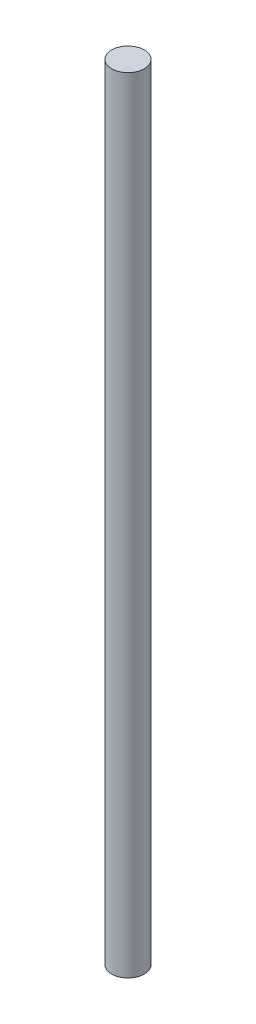
ISO-10303-21;
HEADER;
FILE_DESCRIPTION(('STEP AP214'),'2;1');
FILE_NAME('part.step','',(''),(''),'','','');
FILE_SCHEMA(('AUTOMOTIVE_DESIGN { 1 0 10303 214 1 1 1 1 }'));
ENDSEC;
DATA;
#1=APPLICATION_CONTEXT('core data for automotive mechanical design processes');
#2=APPLICATION_PROTOCOL_DEFINITION('international standard','automotive_design',2000,#1);
#3=PRODUCT_CONTEXT('',#1,'mechanical');
#4=PRODUCT('Part','Part','',(#3));
#5=PRODUCT_RELATED_PRODUCT_CATEGORY('part','',(#4));
#6=PRODUCT_DEFINITION_FORMATION('','',#4);
#7=PRODUCT_DEFINITION_CONTEXT('part definition',#1,'design');
#8=PRODUCT_DEFINITION('design','',#6,#7);
#9=PRODUCT_DEFINITION_SHAPE('','',#8);
#10=(LENGTH_UNIT() NAMED_UNIT(*) SI_UNIT(.MILLI.,.METRE.));
#11=(NAMED_UNIT(*) PLANE_ANGLE_UNIT() SI_UNIT($,.RADIAN.));
#12=(NAMED_UNIT(*) SI_UNIT($,.STERADIAN.) SOLID_ANGLE_UNIT());
#13=UNCERTAINTY_MEASURE_WITH_UNIT(LENGTH_MEASURE(1.E-05),#10,'distance_accuracy_value','');
#14=(GEOMETRIC_REPRESENTATION_CONTEXT(3) GLOBAL_UNCERTAINTY_ASSIGNED_CONTEXT((#13)) GLOBAL_UNIT_ASSIGNED_CONTEXT((#10,
#11,#12)) REPRESENTATION_CONTEXT('',''));
#15=CARTESIAN_POINT('',(0.,0.,0.));
#16=DIRECTION('',(0.,0.,1.));
#17=DIRECTION('',(1.,0.,0.));
#18=AXIS2_PLACEMENT_3D('',#15,#16,#17);
#19=CARTESIAN_POINT('',(0.,300.,0.));
#20=DIRECTION('',(0.,-1.,0.));
#21=DIRECTION('',(0.,0.,-1.));
#22=AXIS2_PLACEMENT_3D('',#19,#20,#21);
#23=CYLINDRICAL_SURFACE('',#22,12.5);
#24=CARTESIAN_POINT('',(0.,300.,0.));
#25=DIRECTION('',(0.,1.,0.));
#26=DIRECTION('',(0.,0.,1.));
#27=AXIS2_PLACEMENT_3D('',#24,#25,#26);
#28=CIRCLE('',#27,12.5);
#29=CARTESIAN_POINT('',(0.,300.,12.5));
#30=VERTEX_POINT('',#29);
#31=EDGE_CURVE('E10',#30,#30,#28,.T.);
#32=ORIENTED_EDGE('',*,*,#31,.F.);
#33=EDGE_LOOP('',(#32));
#34=FACE_BOUND('',#33,.T.);
#35=CARTESIAN_POINT('',(0.,-300.,0.));
#36=DIRECTION('',(0.,1.,0.));
#37=DIRECTION('',(0.,0.,1.));
#38=AXIS2_PLACEMENT_3D('',#35,#36,#37);
#39=CIRCLE('',#38,12.5);
#40=CARTESIAN_POINT('',(0.,-300.,12.5));
#41=VERTEX_POINT('',#40);
#42=EDGE_CURVE('E38',#41,#41,#39,.T.);
#43=ORIENTED_EDGE('',*,*,#42,.T.);
#44=EDGE_LOOP('',(#43));
#45=FACE_BOUND('',#44,.T.);
#46=ADVANCED_FACE('F35',(#34,#45),#23,.T.);
#47=CARTESIAN_POINT('',(0.,300.,0.));
#48=DIRECTION('',(0.,1.,0.));
#49=DIRECTION('',(0.,0.,1.));
#50=AXIS2_PLACEMENT_3D('',#47,#48,#49);
#51=PLANE('',#50);
#52=ORIENTED_EDGE('',*,*,#31,.T.);
#53=EDGE_LOOP('',(#52));
#54=FACE_BOUND('',#53,.T.);
#55=ADVANCED_FACE('F50',(#54),#51,.T.);
#56=CARTESIAN_POINT('',(0.,-300.,0.));
#57=DIRECTION('',(0.,1.,0.));
#58=DIRECTION('',(0.,0.,1.));
#59=AXIS2_PLACEMENT_3D('',#56,#57,#58);
#60=PLANE('',#59);
#61=ORIENTED_EDGE('',*,*,#42,.F.);
#62=EDGE_LOOP('',(#61));
#63=FACE_BOUND('',#62,.T.);
#64=ADVANCED_FACE('F48',(#63),#60,.F.);
#65=CLOSED_SHELL('',(#46,#55,#64));
#66=MANIFOLD_SOLID_BREP('B2',#65);
#67=ADVANCED_BREP_SHAPE_REPRESENTATION('',(#18,#66),#14);
#68=SHAPE_DEFINITION_REPRESENTATION(#9,#67);
ENDSEC;
END-ISO-10303-21;
